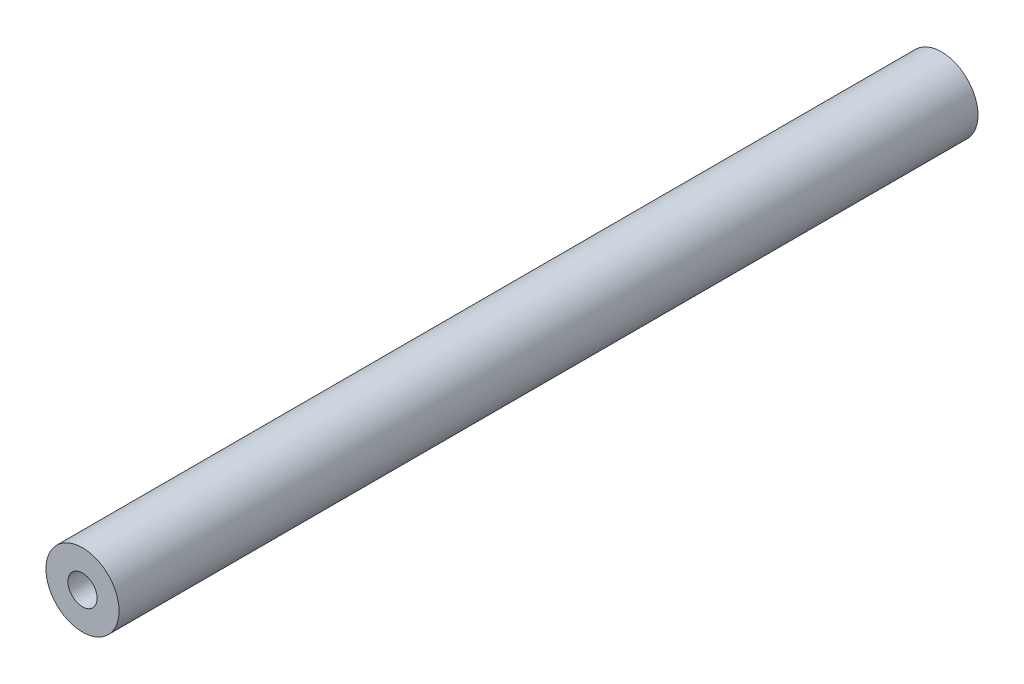
ISO-10303-21;
HEADER;
FILE_DESCRIPTION(('STEP AP214'),'2;1');
FILE_NAME('part.step','',(''),(''),'','','');
FILE_SCHEMA(('AUTOMOTIVE_DESIGN { 1 0 10303 214 1 1 1 1 }'));
ENDSEC;
DATA;
#1=APPLICATION_CONTEXT('core data for automotive mechanical design processes');
#2=APPLICATION_PROTOCOL_DEFINITION('international standard','automotive_design',2000,#1);
#3=PRODUCT_CONTEXT('',#1,'mechanical');
#4=PRODUCT('Part','Part','',(#3));
#5=PRODUCT_RELATED_PRODUCT_CATEGORY('part','',(#4));
#6=PRODUCT_DEFINITION_FORMATION('','',#4);
#7=PRODUCT_DEFINITION_CONTEXT('part definition',#1,'design');
#8=PRODUCT_DEFINITION('design','',#6,#7);
#9=PRODUCT_DEFINITION_SHAPE('','',#8);
#10=(LENGTH_UNIT() NAMED_UNIT(*) SI_UNIT(.MILLI.,.METRE.));
#11=(NAMED_UNIT(*) PLANE_ANGLE_UNIT() SI_UNIT($,.RADIAN.));
#12=(NAMED_UNIT(*) SI_UNIT($,.STERADIAN.) SOLID_ANGLE_UNIT());
#13=UNCERTAINTY_MEASURE_WITH_UNIT(LENGTH_MEASURE(1.E-05),#10,'distance_accuracy_value','');
#14=(GEOMETRIC_REPRESENTATION_CONTEXT(3) GLOBAL_UNCERTAINTY_ASSIGNED_CONTEXT((#13)) GLOBAL_UNIT_ASSIGNED_CONTEXT((#10,
#11,#12)) REPRESENTATION_CONTEXT('',''));
#15=CARTESIAN_POINT('',(0.,0.,0.));
#16=DIRECTION('',(0.,0.,1.));
#17=DIRECTION('',(1.,0.,0.));
#18=AXIS2_PLACEMENT_3D('',#15,#16,#17);
#19=CARTESIAN_POINT('',(0.,0.,47.));
#20=DIRECTION('',(0.,0.,1.));
#21=DIRECTION('',(1.,0.,0.));
#22=AXIS2_PLACEMENT_3D('',#19,#20,#21);
#23=PLANE('',#22);
#24=CARTESIAN_POINT('',(0.,0.,47.));
#25=DIRECTION('',(0.,0.,1.));
#26=DIRECTION('',(1.,0.,0.));
#27=AXIS2_PLACEMENT_3D('',#24,#25,#26);
#28=CIRCLE('',#27,4.);
#29=CARTESIAN_POINT('',(4.,0.,47.));
#30=VERTEX_POINT('',#29);
#31=EDGE_CURVE('E10',#30,#30,#28,.T.);
#32=ORIENTED_EDGE('',*,*,#31,.T.);
#33=EDGE_LOOP('',(#32));
#34=FACE_BOUND('',#33,.T.);
#35=CARTESIAN_POINT('',(0.,0.,47.));
#36=DIRECTION('',(0.,0.,1.));
#37=DIRECTION('',(1.,0.,0.));
#38=AXIS2_PLACEMENT_3D('',#35,#36,#37);
#39=CIRCLE('',#38,1.6);
#40=CARTESIAN_POINT('',(1.6,0.,47.));
#41=VERTEX_POINT('',#40);
#42=EDGE_CURVE('E60',#41,#41,#39,.T.);
#43=ORIENTED_EDGE('',*,*,#42,.F.);
#44=EDGE_LOOP('',(#43));
#45=FACE_BOUND('',#44,.T.);
#46=ADVANCED_FACE('F44',(#34,#45),#23,.T.);
#47=CARTESIAN_POINT('',(0.,0.,-47.));
#48=DIRECTION('',(0.,0.,1.));
#49=DIRECTION('',(1.,0.,0.));
#50=AXIS2_PLACEMENT_3D('',#47,#48,#49);
#51=PLANE('',#50);
#52=CARTESIAN_POINT('',(0.,0.,-47.));
#53=DIRECTION('',(0.,0.,1.));
#54=DIRECTION('',(1.,0.,0.));
#55=AXIS2_PLACEMENT_3D('',#52,#53,#54);
#56=CIRCLE('',#55,4.);
#57=CARTESIAN_POINT('',(4.,0.,-47.));
#58=VERTEX_POINT('',#57);
#59=EDGE_CURVE('E49',#58,#58,#56,.T.);
#60=ORIENTED_EDGE('',*,*,#59,.F.);
#61=EDGE_LOOP('',(#60));
#62=FACE_BOUND('',#61,.T.);
#63=CARTESIAN_POINT('',(0.,0.,-47.));
#64=DIRECTION('',(0.,0.,1.));
#65=DIRECTION('',(1.,0.,0.));
#66=AXIS2_PLACEMENT_3D('',#63,#64,#65);
#67=CIRCLE('',#66,1.6);
#68=CARTESIAN_POINT('',(1.6,0.,-47.));
#69=VERTEX_POINT('',#68);
#70=EDGE_CURVE('E56',#69,#69,#67,.T.);
#71=ORIENTED_EDGE('',*,*,#70,.T.);
#72=EDGE_LOOP('',(#71));
#73=FACE_BOUND('',#72,.T.);
#74=ADVANCED_FACE('F69',(#62,#73),#51,.F.);
#75=CARTESIAN_POINT('',(0.,0.,47.));
#76=DIRECTION('',(0.,0.,-1.));
#77=DIRECTION('',(-1.,0.,0.));
#78=AXIS2_PLACEMENT_3D('',#75,#76,#77);
#79=CYLINDRICAL_SURFACE('',#78,4.);
#80=ORIENTED_EDGE('',*,*,#31,.F.);
#81=EDGE_LOOP('',(#80));
#82=FACE_BOUND('',#81,.T.);
#83=ORIENTED_EDGE('',*,*,#59,.T.);
#84=EDGE_LOOP('',(#83));
#85=FACE_BOUND('',#84,.T.);
#86=ADVANCED_FACE('F48',(#82,#85),#79,.T.);
#87=CARTESIAN_POINT('',(0.,0.,47.));
#88=DIRECTION('',(0.,0.,-1.));
#89=DIRECTION('',(-1.,0.,0.));
#90=AXIS2_PLACEMENT_3D('',#87,#88,#89);
#91=CYLINDRICAL_SURFACE('',#90,1.6);
#92=ORIENTED_EDGE('',*,*,#42,.T.);
#93=EDGE_LOOP('',(#92));
#94=FACE_BOUND('',#93,.T.);
#95=ORIENTED_EDGE('',*,*,#70,.F.);
#96=EDGE_LOOP('',(#95));
#97=FACE_BOUND('',#96,.T.);
#98=ADVANCED_FACE('F62',(#94,#97),#91,.F.);
#99=CLOSED_SHELL('',(#46,#74,#86,#98));
#100=MANIFOLD_SOLID_BREP('B2',#99);
#101=ADVANCED_BREP_SHAPE_REPRESENTATION('',(#18,#100),#14);
#102=SHAPE_DEFINITION_REPRESENTATION(#9,#101);
ENDSEC;
END-ISO-10303-21;
